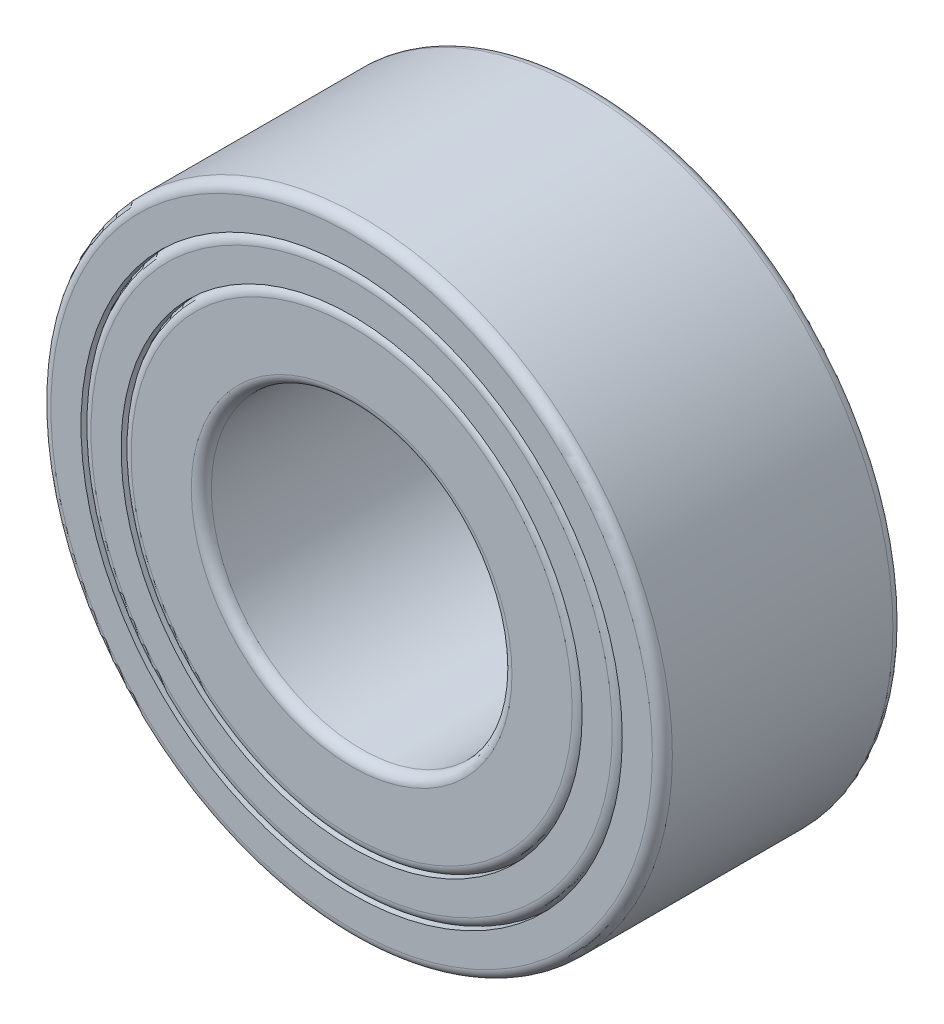
ISO-10303-21;
HEADER;
FILE_DESCRIPTION(('STEP AP214'),'2;1');
FILE_NAME('part.step','',(''),(''),'','','');
FILE_SCHEMA(('AUTOMOTIVE_DESIGN { 1 0 10303 214 1 1 1 1 }'));
ENDSEC;
DATA;
#1=APPLICATION_CONTEXT('core data for automotive mechanical design processes');
#2=APPLICATION_PROTOCOL_DEFINITION('international standard','automotive_design',2000,#1);
#3=PRODUCT_CONTEXT('',#1,'mechanical');
#4=PRODUCT('Part','Part','',(#3));
#5=PRODUCT_RELATED_PRODUCT_CATEGORY('part','',(#4));
#6=PRODUCT_DEFINITION_FORMATION('','',#4);
#7=PRODUCT_DEFINITION_CONTEXT('part definition',#1,'design');
#8=PRODUCT_DEFINITION('design','',#6,#7);
#9=PRODUCT_DEFINITION_SHAPE('','',#8);
#10=(LENGTH_UNIT() NAMED_UNIT(*) SI_UNIT(.MILLI.,.METRE.));
#11=(NAMED_UNIT(*) PLANE_ANGLE_UNIT() SI_UNIT($,.RADIAN.));
#12=(NAMED_UNIT(*) SI_UNIT($,.STERADIAN.) SOLID_ANGLE_UNIT());
#13=UNCERTAINTY_MEASURE_WITH_UNIT(LENGTH_MEASURE(1.E-05),#10,'distance_accuracy_value','');
#14=(GEOMETRIC_REPRESENTATION_CONTEXT(3) GLOBAL_UNCERTAINTY_ASSIGNED_CONTEXT((#13)) GLOBAL_UNIT_ASSIGNED_CONTEXT((#10,
#11,#12)) REPRESENTATION_CONTEXT('',''));
#15=CARTESIAN_POINT('',(0.,0.,0.));
#16=DIRECTION('',(0.,0.,1.));
#17=DIRECTION('',(1.,0.,0.));
#18=AXIS2_PLACEMENT_3D('',#15,#16,#17);
#19=CARTESIAN_POINT('',(0.,0.,24.));
#20=DIRECTION('',(0.,0.,1.));
#21=DIRECTION('',(1.,0.,0.));
#22=AXIS2_PLACEMENT_3D('',#19,#20,#21);
#23=PLANE('',#22);
#24=CARTESIAN_POINT('',(0.,0.,24.));
#25=DIRECTION('',(0.,0.,1.));
#26=DIRECTION('',(1.,0.,0.));
#27=AXIS2_PLACEMENT_3D('',#24,#25,#26);
#28=CIRCLE('',#27,16.);
#29=CARTESIAN_POINT('',(16.,0.,24.));
#30=VERTEX_POINT('',#29);
#31=EDGE_CURVE('E41',#30,#30,#28,.F.);
#32=ORIENTED_EDGE('',*,*,#31,.T.);
#33=EDGE_LOOP('',(#32));
#34=FACE_BOUND('',#33,.T.);
#35=CARTESIAN_POINT('',(0.,0.,24.));
#36=DIRECTION('',(0.,0.,1.));
#37=DIRECTION('',(1.,0.,0.));
#38=AXIS2_PLACEMENT_3D('',#35,#36,#37);
#39=CIRCLE('',#38,22.);
#40=CARTESIAN_POINT('',(22.,0.,24.));
#41=VERTEX_POINT('',#40);
#42=EDGE_CURVE('E78',#41,#41,#39,.T.);
#43=ORIENTED_EDGE('',*,*,#42,.T.);
#44=EDGE_LOOP('',(#43));
#45=FACE_BOUND('',#44,.T.);
#46=ADVANCED_FACE('F34',(#34,#45),#23,.T.);
#47=CARTESIAN_POINT('',(0.,0.,0.));
#48=DIRECTION('',(0.,0.,1.));
#49=DIRECTION('',(1.,0.,0.));
#50=AXIS2_PLACEMENT_3D('',#47,#48,#49);
#51=PLANE('',#50);
#52=CARTESIAN_POINT('',(0.,0.,0.));
#53=DIRECTION('',(0.,0.,1.));
#54=DIRECTION('',(1.,0.,0.));
#55=AXIS2_PLACEMENT_3D('',#52,#53,#54);
#56=CIRCLE('',#55,16.);
#57=CARTESIAN_POINT('',(16.,0.,0.));
#58=VERTEX_POINT('',#57);
#59=EDGE_CURVE('E10',#58,#58,#56,.T.);
#60=ORIENTED_EDGE('',*,*,#59,.T.);
#61=EDGE_LOOP('',(#60));
#62=FACE_BOUND('',#61,.T.);
#63=CARTESIAN_POINT('',(0.,0.,0.));
#64=DIRECTION('',(0.,0.,1.));
#65=DIRECTION('',(1.,0.,0.));
#66=AXIS2_PLACEMENT_3D('',#63,#64,#65);
#67=CIRCLE('',#66,22.);
#68=CARTESIAN_POINT('',(22.,0.,0.));
#69=VERTEX_POINT('',#68);
#70=EDGE_CURVE('E81',#69,#69,#67,.F.);
#71=ORIENTED_EDGE('',*,*,#70,.T.);
#72=EDGE_LOOP('',(#71));
#73=FACE_BOUND('',#72,.T.);
#74=ADVANCED_FACE('F122',(#62,#73),#51,.F.);
#75=CARTESIAN_POINT('',(0.,0.,24.));
#76=DIRECTION('',(0.,0.,-1.));
#77=DIRECTION('',(-1.,0.,0.));
#78=AXIS2_PLACEMENT_3D('',#75,#76,#77);
#79=CYLINDRICAL_SURFACE('',#78,15.);
#80=CARTESIAN_POINT('',(0.,0.,23.));
#81=DIRECTION('',(0.,0.,1.));
#82=DIRECTION('',(1.,0.,0.));
#83=AXIS2_PLACEMENT_3D('',#80,#81,#82);
#84=CIRCLE('',#83,15.);
#85=CARTESIAN_POINT('',(15.,0.,23.));
#86=VERTEX_POINT('',#85);
#87=EDGE_CURVE('E45',#86,#86,#84,.T.);
#88=ORIENTED_EDGE('',*,*,#87,.T.);
#89=EDGE_LOOP('',(#88));
#90=FACE_BOUND('',#89,.T.);
#91=CARTESIAN_POINT('',(0.,0.,1.));
#92=DIRECTION('',(0.,0.,1.));
#93=DIRECTION('',(1.,0.,0.));
#94=AXIS2_PLACEMENT_3D('',#91,#92,#93);
#95=CIRCLE('',#94,15.);
#96=CARTESIAN_POINT('',(15.,0.,1.));
#97=VERTEX_POINT('',#96);
#98=EDGE_CURVE('E49',#97,#97,#95,.F.);
#99=ORIENTED_EDGE('',*,*,#98,.T.);
#100=EDGE_LOOP('',(#99));
#101=FACE_BOUND('',#100,.T.);
#102=ADVANCED_FACE('F127',(#90,#101),#79,.F.);
#103=CARTESIAN_POINT('',(0.,0.,1.));
#104=DIRECTION('',(0.,0.,1.));
#105=DIRECTION('',(1.,0.,0.));
#106=AXIS2_PLACEMENT_3D('',#103,#104,#105);
#107=TOROIDAL_SURFACE('',#106,22.,1.);
#108=ORIENTED_EDGE('',*,*,#70,.F.);
#109=EDGE_LOOP('',(#108));
#110=FACE_BOUND('',#109,.T.);
#111=CARTESIAN_POINT('',(0.,0.,1.));
#112=DIRECTION('',(0.,0.,1.));
#113=DIRECTION('',(1.,0.,0.));
#114=AXIS2_PLACEMENT_3D('',#111,#112,#113);
#115=CIRCLE('',#114,23.);
#116=CARTESIAN_POINT('',(23.,0.,1.));
#117=VERTEX_POINT('',#116);
#118=EDGE_CURVE('E84',#117,#117,#115,.T.);
#119=ORIENTED_EDGE('',*,*,#118,.F.);
#120=EDGE_LOOP('',(#119));
#121=FACE_BOUND('',#120,.T.);
#122=ADVANCED_FACE('F133',(#110,#121),#107,.T.);
#123=CARTESIAN_POINT('',(0.,0.,23.));
#124=DIRECTION('',(0.,0.,1.));
#125=DIRECTION('',(1.,0.,0.));
#126=AXIS2_PLACEMENT_3D('',#123,#124,#125);
#127=TOROIDAL_SURFACE('',#126,22.,1.);
#128=CARTESIAN_POINT('',(0.,0.,23.));
#129=DIRECTION('',(0.,0.,1.));
#130=DIRECTION('',(1.,0.,0.));
#131=AXIS2_PLACEMENT_3D('',#128,#129,#130);
#132=CIRCLE('',#131,23.);
#133=CARTESIAN_POINT('',(23.,0.,23.));
#134=VERTEX_POINT('',#133);
#135=EDGE_CURVE('E87',#134,#134,#132,.F.);
#136=ORIENTED_EDGE('',*,*,#135,.F.);
#137=EDGE_LOOP('',(#136));
#138=FACE_BOUND('',#137,.T.);
#139=ORIENTED_EDGE('',*,*,#42,.F.);
#140=EDGE_LOOP('',(#139));
#141=FACE_BOUND('',#140,.T.);
#142=ADVANCED_FACE('F136',(#138,#141),#127,.T.);
#143=CARTESIAN_POINT('',(0.,0.,24.));
#144=DIRECTION('',(0.,0.,-1.));
#145=DIRECTION('',(-1.,0.,0.));
#146=AXIS2_PLACEMENT_3D('',#143,#144,#145);
#147=CYLINDRICAL_SURFACE('',#146,23.);
#148=CARTESIAN_POINT('',(0.,0.,0.));
#149=DIRECTION('',(0.,0.,1.));
#150=DIRECTION('',(1.,0.,0.));
#151=AXIS2_PLACEMENT_3D('',#148,#149,#150);
#152=CIRCLE('',#151,23.);
#153=CARTESIAN_POINT('',(23.,0.,0.));
#154=VERTEX_POINT('',#153);
#155=EDGE_CURVE('E91',#154,#154,#152,.T.);
#156=ORIENTED_EDGE('',*,*,#155,.F.);
#157=EDGE_LOOP('',(#156));
#158=FACE_BOUND('',#157,.T.);
#159=ORIENTED_EDGE('',*,*,#118,.T.);
#160=EDGE_LOOP('',(#159));
#161=FACE_BOUND('',#160,.T.);
#162=ADVANCED_FACE('F140',(#158,#161),#147,.F.);
#163=CARTESIAN_POINT('',(0.,0.,24.));
#164=DIRECTION('',(0.,0.,1.));
#165=DIRECTION('',(1.,0.,0.));
#166=AXIS2_PLACEMENT_3D('',#163,#164,#165);
#167=PLANE('',#166);
#168=CARTESIAN_POINT('',(0.,0.,24.));
#169=DIRECTION('',(0.,0.,1.));
#170=DIRECTION('',(1.,0.,0.));
#171=AXIS2_PLACEMENT_3D('',#168,#169,#170);
#172=CIRCLE('',#171,26.);
#173=CARTESIAN_POINT('',(26.,0.,24.));
#174=VERTEX_POINT('',#173);
#175=EDGE_CURVE('E75',#174,#174,#172,.T.);
#176=ORIENTED_EDGE('',*,*,#175,.T.);
#177=EDGE_LOOP('',(#176));
#178=FACE_BOUND('',#177,.T.);
#179=CARTESIAN_POINT('',(0.,0.,24.));
#180=DIRECTION('',(0.,0.,1.));
#181=DIRECTION('',(1.,0.,0.));
#182=AXIS2_PLACEMENT_3D('',#179,#180,#181);
#183=CIRCLE('',#182,23.);
#184=CARTESIAN_POINT('',(23.,0.,24.));
#185=VERTEX_POINT('',#184);
#186=EDGE_CURVE('E90',#185,#185,#183,.T.);
#187=ORIENTED_EDGE('',*,*,#186,.F.);
#188=EDGE_LOOP('',(#187));
#189=FACE_BOUND('',#188,.T.);
#190=ADVANCED_FACE('F189',(#178,#189),#167,.T.);
#191=CARTESIAN_POINT('',(0.,0.,0.));
#192=DIRECTION('',(0.,0.,1.));
#193=DIRECTION('',(1.,0.,0.));
#194=AXIS2_PLACEMENT_3D('',#191,#192,#193);
#195=PLANE('',#194);
#196=CARTESIAN_POINT('',(0.,0.,0.));
#197=DIRECTION('',(0.,0.,1.));
#198=DIRECTION('',(1.,0.,0.));
#199=AXIS2_PLACEMENT_3D('',#196,#197,#198);
#200=CIRCLE('',#199,26.);
#201=CARTESIAN_POINT('',(26.,0.,0.));
#202=VERTEX_POINT('',#201);
#203=EDGE_CURVE('E66',#202,#202,#200,.F.);
#204=ORIENTED_EDGE('',*,*,#203,.T.);
#205=EDGE_LOOP('',(#204));
#206=FACE_BOUND('',#205,.T.);
#207=ORIENTED_EDGE('',*,*,#155,.T.);
#208=EDGE_LOOP('',(#207));
#209=FACE_BOUND('',#208,.T.);
#210=ADVANCED_FACE('F198',(#206,#209),#195,.F.);
#211=ORIENTED_EDGE('',*,*,#135,.T.);
#212=EDGE_LOOP('',(#211));
#213=FACE_BOUND('',#212,.T.);
#214=ORIENTED_EDGE('',*,*,#186,.T.);
#215=EDGE_LOOP('',(#214));
#216=FACE_BOUND('',#215,.T.);
#217=ADVANCED_FACE('F145',(#213,#216),#147,.F.);
#218=CARTESIAN_POINT('',(0.,0.,23.));
#219=DIRECTION('',(0.,0.,1.));
#220=DIRECTION('',(1.,0.,0.));
#221=AXIS2_PLACEMENT_3D('',#218,#219,#220);
#222=TOROIDAL_SURFACE('',#221,26.,1.);
#223=CARTESIAN_POINT('',(0.,0.,23.));
#224=DIRECTION('',(0.,0.,1.));
#225=DIRECTION('',(1.,0.,0.));
#226=AXIS2_PLACEMENT_3D('',#223,#224,#225);
#227=CIRCLE('',#226,27.);
#228=CARTESIAN_POINT('',(27.,0.,23.));
#229=VERTEX_POINT('',#228);
#230=EDGE_CURVE('E69',#229,#229,#227,.F.);
#231=ORIENTED_EDGE('',*,*,#230,.F.);
#232=EDGE_LOOP('',(#231));
#233=FACE_BOUND('',#232,.T.);
#234=ORIENTED_EDGE('',*,*,#175,.F.);
#235=EDGE_LOOP('',(#234));
#236=FACE_BOUND('',#235,.T.);
#237=ADVANCED_FACE('F142',(#233,#236),#222,.T.);
#238=CARTESIAN_POINT('',(0.,0.,1.));
#239=DIRECTION('',(0.,0.,1.));
#240=DIRECTION('',(1.,0.,0.));
#241=AXIS2_PLACEMENT_3D('',#238,#239,#240);
#242=TOROIDAL_SURFACE('',#241,26.,1.);
#243=ORIENTED_EDGE('',*,*,#203,.F.);
#244=EDGE_LOOP('',(#243));
#245=FACE_BOUND('',#244,.T.);
#246=CARTESIAN_POINT('',(0.,0.,1.));
#247=DIRECTION('',(0.,0.,1.));
#248=DIRECTION('',(1.,0.,0.));
#249=AXIS2_PLACEMENT_3D('',#246,#247,#248);
#250=CIRCLE('',#249,27.);
#251=CARTESIAN_POINT('',(27.,0.,1.));
#252=VERTEX_POINT('',#251);
#253=EDGE_CURVE('E72',#252,#252,#250,.T.);
#254=ORIENTED_EDGE('',*,*,#253,.F.);
#255=EDGE_LOOP('',(#254));
#256=FACE_BOUND('',#255,.T.);
#257=ADVANCED_FACE('F118',(#245,#256),#242,.T.);
#258=CARTESIAN_POINT('',(0.,0.,24.));
#259=DIRECTION('',(0.,0.,-1.));
#260=DIRECTION('',(-1.,0.,0.));
#261=AXIS2_PLACEMENT_3D('',#258,#259,#260);
#262=CYLINDRICAL_SURFACE('',#261,27.);
#263=CARTESIAN_POINT('',(0.,0.,0.));
#264=DIRECTION('',(0.,0.,1.));
#265=DIRECTION('',(1.,0.,0.));
#266=AXIS2_PLACEMENT_3D('',#263,#264,#265);
#267=CIRCLE('',#266,27.);
#268=CARTESIAN_POINT('',(27.,0.,0.));
#269=VERTEX_POINT('',#268);
#270=EDGE_CURVE('E97',#269,#269,#267,.T.);
#271=ORIENTED_EDGE('',*,*,#270,.F.);
#272=EDGE_LOOP('',(#271));
#273=FACE_BOUND('',#272,.T.);
#274=ORIENTED_EDGE('',*,*,#253,.T.);
#275=EDGE_LOOP('',(#274));
#276=FACE_BOUND('',#275,.T.);
#277=ADVANCED_FACE('F108',(#273,#276),#262,.F.);
#278=CARTESIAN_POINT('',(0.,0.,24.));
#279=DIRECTION('',(0.,0.,1.));
#280=DIRECTION('',(1.,0.,0.));
#281=AXIS2_PLACEMENT_3D('',#278,#279,#280);
#282=PLANE('',#281);
#283=CARTESIAN_POINT('',(0.,0.,24.));
#284=DIRECTION('',(0.,0.,1.));
#285=DIRECTION('',(1.,0.,0.));
#286=AXIS2_PLACEMENT_3D('',#283,#284,#285);
#287=CIRCLE('',#286,30.);
#288=CARTESIAN_POINT('',(30.,0.,24.));
#289=VERTEX_POINT('',#288);
#290=EDGE_CURVE('E54',#289,#289,#287,.T.);
#291=ORIENTED_EDGE('',*,*,#290,.T.);
#292=EDGE_LOOP('',(#291));
#293=FACE_BOUND('',#292,.T.);
#294=CARTESIAN_POINT('',(0.,0.,24.));
#295=DIRECTION('',(0.,0.,1.));
#296=DIRECTION('',(1.,0.,0.));
#297=AXIS2_PLACEMENT_3D('',#294,#295,#296);
#298=CIRCLE('',#297,27.);
#299=CARTESIAN_POINT('',(27.,0.,24.));
#300=VERTEX_POINT('',#299);
#301=EDGE_CURVE('E94',#300,#300,#298,.T.);
#302=ORIENTED_EDGE('',*,*,#301,.F.);
#303=EDGE_LOOP('',(#302));
#304=FACE_BOUND('',#303,.T.);
#305=ADVANCED_FACE('F105',(#293,#304),#282,.T.);
#306=CARTESIAN_POINT('',(0.,0.,0.));
#307=DIRECTION('',(0.,0.,1.));
#308=DIRECTION('',(1.,0.,0.));
#309=AXIS2_PLACEMENT_3D('',#306,#307,#308);
#310=PLANE('',#309);
#311=CARTESIAN_POINT('',(0.,0.,0.));
#312=DIRECTION('',(0.,0.,1.));
#313=DIRECTION('',(1.,0.,0.));
#314=AXIS2_PLACEMENT_3D('',#311,#312,#313);
#315=CIRCLE('',#314,30.);
#316=CARTESIAN_POINT('',(30.,0.,0.));
#317=VERTEX_POINT('',#316);
#318=EDGE_CURVE('E57',#317,#317,#315,.F.);
#319=ORIENTED_EDGE('',*,*,#318,.T.);
#320=EDGE_LOOP('',(#319));
#321=FACE_BOUND('',#320,.T.);
#322=ORIENTED_EDGE('',*,*,#270,.T.);
#323=EDGE_LOOP('',(#322));
#324=FACE_BOUND('',#323,.T.);
#325=ADVANCED_FACE('F107',(#321,#324),#310,.F.);
#326=CARTESIAN_POINT('',(0.,0.,24.));
#327=DIRECTION('',(0.,0.,-1.));
#328=DIRECTION('',(-1.,0.,0.));
#329=AXIS2_PLACEMENT_3D('',#326,#327,#328);
#330=CYLINDRICAL_SURFACE('',#329,31.);
#331=CARTESIAN_POINT('',(0.,0.,1.));
#332=DIRECTION('',(0.,0.,1.));
#333=DIRECTION('',(1.,0.,0.));
#334=AXIS2_PLACEMENT_3D('',#331,#332,#333);
#335=CIRCLE('',#334,31.);
#336=CARTESIAN_POINT('',(31.,0.,1.));
#337=VERTEX_POINT('',#336);
#338=EDGE_CURVE('E60',#337,#337,#335,.T.);
#339=ORIENTED_EDGE('',*,*,#338,.T.);
#340=EDGE_LOOP('',(#339));
#341=FACE_BOUND('',#340,.T.);
#342=CARTESIAN_POINT('',(0.,0.,23.));
#343=DIRECTION('',(0.,0.,1.));
#344=DIRECTION('',(1.,0.,0.));
#345=AXIS2_PLACEMENT_3D('',#342,#343,#344);
#346=CIRCLE('',#345,31.);
#347=CARTESIAN_POINT('',(31.,0.,23.));
#348=VERTEX_POINT('',#347);
#349=EDGE_CURVE('E63',#348,#348,#346,.F.);
#350=ORIENTED_EDGE('',*,*,#349,.T.);
#351=EDGE_LOOP('',(#350));
#352=FACE_BOUND('',#351,.T.);
#353=ADVANCED_FACE('F115',(#341,#352),#330,.T.);
#354=ORIENTED_EDGE('',*,*,#230,.T.);
#355=EDGE_LOOP('',(#354));
#356=FACE_BOUND('',#355,.T.);
#357=ORIENTED_EDGE('',*,*,#301,.T.);
#358=EDGE_LOOP('',(#357));
#359=FACE_BOUND('',#358,.T.);
#360=ADVANCED_FACE('F103',(#356,#359),#262,.F.);
#361=CARTESIAN_POINT('',(0.,0.,1.));
#362=DIRECTION('',(0.,0.,1.));
#363=DIRECTION('',(1.,0.,0.));
#364=AXIS2_PLACEMENT_3D('',#361,#362,#363);
#365=TOROIDAL_SURFACE('',#364,30.,1.);
#366=ORIENTED_EDGE('',*,*,#318,.F.);
#367=EDGE_LOOP('',(#366));
#368=FACE_BOUND('',#367,.T.);
#369=ORIENTED_EDGE('',*,*,#338,.F.);
#370=EDGE_LOOP('',(#369));
#371=FACE_BOUND('',#370,.T.);
#372=ADVANCED_FACE('F150',(#368,#371),#365,.T.);
#373=CARTESIAN_POINT('',(0.,0.,23.));
#374=DIRECTION('',(0.,0.,1.));
#375=DIRECTION('',(1.,0.,0.));
#376=AXIS2_PLACEMENT_3D('',#373,#374,#375);
#377=TOROIDAL_SURFACE('',#376,30.,1.);
#378=ORIENTED_EDGE('',*,*,#349,.F.);
#379=EDGE_LOOP('',(#378));
#380=FACE_BOUND('',#379,.T.);
#381=ORIENTED_EDGE('',*,*,#290,.F.);
#382=EDGE_LOOP('',(#381));
#383=FACE_BOUND('',#382,.T.);
#384=ADVANCED_FACE('F153',(#380,#383),#377,.T.);
#385=CARTESIAN_POINT('',(0.,0.,23.));
#386=DIRECTION('',(0.,0.,1.));
#387=DIRECTION('',(1.,0.,0.));
#388=AXIS2_PLACEMENT_3D('',#385,#386,#387);
#389=TOROIDAL_SURFACE('',#388,16.,1.);
#390=ORIENTED_EDGE('',*,*,#31,.F.);
#391=EDGE_LOOP('',(#390));
#392=FACE_BOUND('',#391,.T.);
#393=ORIENTED_EDGE('',*,*,#87,.F.);
#394=EDGE_LOOP('',(#393));
#395=FACE_BOUND('',#394,.T.);
#396=ADVANCED_FACE('F156',(#392,#395),#389,.T.);
#397=CARTESIAN_POINT('',(0.,0.,1.));
#398=DIRECTION('',(0.,0.,1.));
#399=DIRECTION('',(1.,0.,0.));
#400=AXIS2_PLACEMENT_3D('',#397,#398,#399);
#401=TOROIDAL_SURFACE('',#400,16.,1.);
#402=ORIENTED_EDGE('',*,*,#98,.F.);
#403=EDGE_LOOP('',(#402));
#404=FACE_BOUND('',#403,.T.);
#405=ORIENTED_EDGE('',*,*,#59,.F.);
#406=EDGE_LOOP('',(#405));
#407=FACE_BOUND('',#406,.T.);
#408=ADVANCED_FACE('F36',(#404,#407),#401,.T.);
#409=CLOSED_SHELL('',(#46,#74,#102,#122,#142,#162,#190,#210,#217,#237,#257,#277,#305,#325,#353,
#360,#372,#384,#396,#408));
#410=MANIFOLD_SOLID_BREP('B2',#409);
#411=ADVANCED_BREP_SHAPE_REPRESENTATION('',(#18,#410),#14);
#412=SHAPE_DEFINITION_REPRESENTATION(#9,#411);
ENDSEC;
END-ISO-10303-21;
